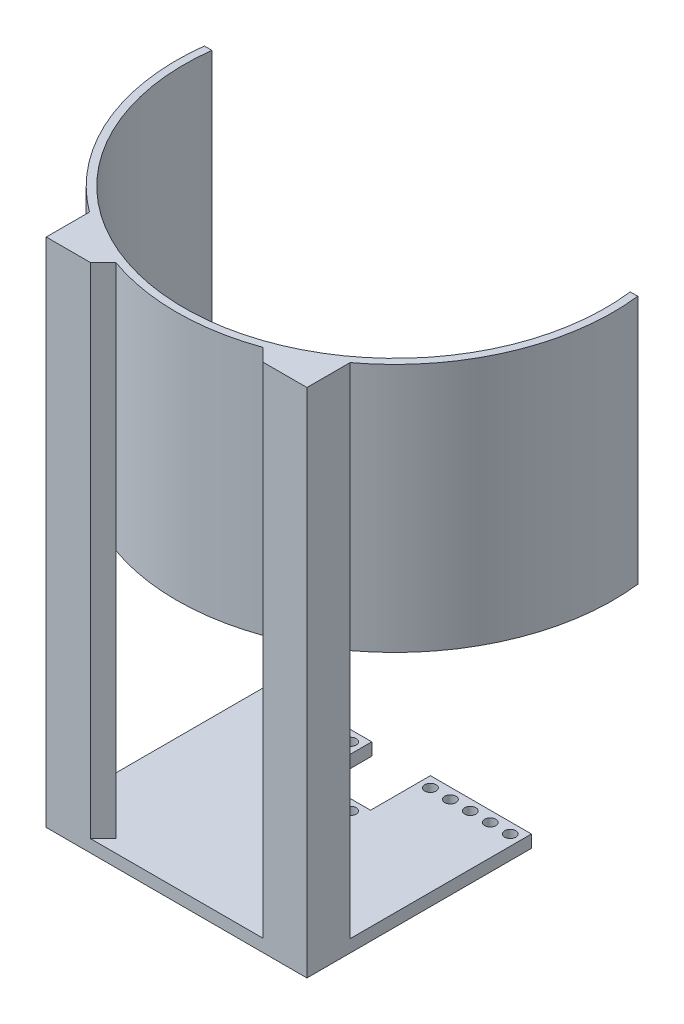
ISO-10303-21;
HEADER;
FILE_DESCRIPTION(('STEP AP214'),'2;1');
FILE_NAME('part.step','',(''),(''),'','','');
FILE_SCHEMA(('AUTOMOTIVE_DESIGN { 1 0 10303 214 1 1 1 1 }'));
ENDSEC;
DATA;
#1=APPLICATION_CONTEXT('core data for automotive mechanical design processes');
#2=APPLICATION_PROTOCOL_DEFINITION('international standard','automotive_design',2000,#1);
#3=PRODUCT_CONTEXT('',#1,'mechanical');
#4=PRODUCT('Part','Part','',(#3));
#5=PRODUCT_RELATED_PRODUCT_CATEGORY('part','',(#4));
#6=PRODUCT_DEFINITION_FORMATION('','',#4);
#7=PRODUCT_DEFINITION_CONTEXT('part definition',#1,'design');
#8=PRODUCT_DEFINITION('design','',#6,#7);
#9=PRODUCT_DEFINITION_SHAPE('','',#8);
#10=(LENGTH_UNIT() NAMED_UNIT(*) SI_UNIT(.MILLI.,.METRE.));
#11=(NAMED_UNIT(*) PLANE_ANGLE_UNIT() SI_UNIT($,.RADIAN.));
#12=(NAMED_UNIT(*) SI_UNIT($,.STERADIAN.) SOLID_ANGLE_UNIT());
#13=UNCERTAINTY_MEASURE_WITH_UNIT(LENGTH_MEASURE(1.E-05),#10,'distance_accuracy_value','');
#14=(GEOMETRIC_REPRESENTATION_CONTEXT(3) GLOBAL_UNCERTAINTY_ASSIGNED_CONTEXT((#13)) GLOBAL_UNIT_ASSIGNED_CONTEXT((#10,
#11,#12)) REPRESENTATION_CONTEXT('',''));
#15=CARTESIAN_POINT('',(0.,0.,0.));
#16=DIRECTION('',(0.,0.,1.));
#17=DIRECTION('',(1.,0.,0.));
#18=AXIS2_PLACEMENT_3D('',#15,#16,#17);
#19=CARTESIAN_POINT('',(0.,5.,0.));
#20=DIRECTION('',(0.,1.,0.));
#21=DIRECTION('',(0.,0.,1.));
#22=AXIS2_PLACEMENT_3D('',#19,#20,#21);
#23=PLANE('',#22);
#24=CARTESIAN_POINT('',(0.,5.,-42.5));
#25=DIRECTION('',(0.,1.,0.));
#26=DIRECTION('',(0.,0.,1.));
#27=AXIS2_PLACEMENT_3D('',#24,#25,#26);
#28=CIRCLE('',#27,87.5);
#29=CARTESIAN_POINT('',(29.4628176429395,5.,39.8904871726032));
#30=VERTEX_POINT('',#29);
#31=CARTESIAN_POINT('',(52.25,5.,27.6868043153412));
#32=VERTEX_POINT('',#31);
#33=EDGE_CURVE('E261',#30,#32,#28,.T.);
#34=ORIENTED_EDGE('',*,*,#33,.T.);
#35=DIRECTION('',(0.,0.,1.));
#36=VECTOR('',#35,1.);
#37=CARTESIAN_POINT('',(52.25,5.,0.));
#38=LINE('',#37,#36);
#39=CARTESIAN_POINT('',(52.25,5.,-45.));
#40=VERTEX_POINT('',#39);
#41=EDGE_CURVE('E373',#40,#32,#38,.T.);
#42=ORIENTED_EDGE('',*,*,#41,.F.);
#43=DIRECTION('',(1.,0.,0.));
#44=VECTOR('',#43,1.);
#45=CARTESIAN_POINT('',(0.,5.,-45.));
#46=LINE('',#45,#44);
#47=CARTESIAN_POINT('',(11.75,5.,-45.));
#48=VERTEX_POINT('',#47);
#49=EDGE_CURVE('E369',#48,#40,#46,.T.);
#50=ORIENTED_EDGE('',*,*,#49,.F.);
#51=DIRECTION('',(0.,0.,-1.));
#52=VECTOR('',#51,1.);
#53=CARTESIAN_POINT('',(11.75,5.,0.));
#54=LINE('',#53,#52);
#55=CARTESIAN_POINT('',(11.75,5.,-21.));
#56=VERTEX_POINT('',#55);
#57=EDGE_CURVE('E358',#56,#48,#54,.T.);
#58=ORIENTED_EDGE('',*,*,#57,.F.);
#59=DIRECTION('',(1.,0.,0.));
#60=VECTOR('',#59,1.);
#61=CARTESIAN_POINT('',(0.,5.,-21.));
#62=LINE('',#61,#60);
#63=CARTESIAN_POINT('',(-11.75,5.,-21.));
#64=VERTEX_POINT('',#63);
#65=EDGE_CURVE('E361',#64,#56,#62,.T.);
#66=ORIENTED_EDGE('',*,*,#65,.F.);
#67=DIRECTION('',(0.,0.,-1.));
#68=VECTOR('',#67,1.);
#69=CARTESIAN_POINT('',(-11.75,5.,0.));
#70=LINE('',#69,#68);
#71=CARTESIAN_POINT('',(-11.75,5.,-45.));
#72=VERTEX_POINT('',#71);
#73=EDGE_CURVE('E364',#64,#72,#70,.T.);
#74=ORIENTED_EDGE('',*,*,#73,.T.);
#75=CARTESIAN_POINT('',(-52.25,5.,-45.));
#76=VERTEX_POINT('',#75);
#77=EDGE_CURVE('E366',#76,#72,#46,.T.);
#78=ORIENTED_EDGE('',*,*,#77,.F.);
#79=DIRECTION('',(0.,0.,1.));
#80=VECTOR('',#79,1.);
#81=CARTESIAN_POINT('',(-52.25,5.,0.));
#82=LINE('',#81,#80);
#83=CARTESIAN_POINT('',(-52.25,5.,27.6868043153412));
#84=VERTEX_POINT('',#83);
#85=EDGE_CURVE('E107',#76,#84,#82,.T.);
#86=ORIENTED_EDGE('',*,*,#85,.T.);
#87=CARTESIAN_POINT('',(0.,5.,-42.5));
#88=DIRECTION('',(0.,1.,0.));
#89=DIRECTION('',(0.,0.,1.));
#90=AXIS2_PLACEMENT_3D('',#87,#88,#89);
#91=CIRCLE('',#90,87.5);
#92=CARTESIAN_POINT('',(-29.4628176429395,5.,39.8904871726032));
#93=VERTEX_POINT('',#92);
#94=EDGE_CURVE('E320',#84,#93,#91,.T.);
#95=ORIENTED_EDGE('',*,*,#94,.T.);
#96=DIRECTION('',(0.707106781186544,0.,-0.707106781186552));
#97=VECTOR('',#96,1.);
#98=CARTESIAN_POINT('',(5.21383476483168,5.,5.21383476483162));
#99=LINE('',#98,#97);
#100=CARTESIAN_POINT('',(-34.5723304703362,5.,45.));
#101=VERTEX_POINT('',#100);
#102=EDGE_CURVE('E101',#101,#93,#99,.T.);
#103=ORIENTED_EDGE('',*,*,#102,.F.);
#104=DIRECTION('',(1.,0.,0.));
#105=VECTOR('',#104,1.);
#106=CARTESIAN_POINT('',(0.,5.,45.));
#107=LINE('',#106,#105);
#108=CARTESIAN_POINT('',(34.5723304703362,5.,45.));
#109=VERTEX_POINT('',#108);
#110=EDGE_CURVE('E371',#101,#109,#107,.T.);
#111=ORIENTED_EDGE('',*,*,#110,.T.);
#112=DIRECTION('',(-0.707106781186544,0.,-0.707106781186552));
#113=VECTOR('',#112,1.);
#114=CARTESIAN_POINT('',(-5.21383476483168,5.,5.21383476483162));
#115=LINE('',#114,#113);
#116=EDGE_CURVE('E310',#109,#30,#115,.T.);
#117=ORIENTED_EDGE('',*,*,#116,.T.);
#118=EDGE_LOOP('',(#34,#42,#50,#58,#66,#74,#78,#86,#95,#103,#111,#117));
#119=FACE_BOUND('',#118,.T.);
#120=CARTESIAN_POINT('',(16.,5.,-40.75));
#121=DIRECTION('',(0.,1.,0.));
#122=DIRECTION('',(0.,0.,1.));
#123=AXIS2_PLACEMENT_3D('',#120,#121,#122);
#124=CIRCLE('',#123,2.25);
#125=CARTESIAN_POINT('',(16.,5.,-38.5));
#126=VERTEX_POINT('',#125);
#127=EDGE_CURVE('E333',#126,#126,#124,.F.);
#128=ORIENTED_EDGE('',*,*,#127,.T.);
#129=EDGE_LOOP('',(#128));
#130=FACE_BOUND('',#129,.T.);
#131=CARTESIAN_POINT('',(32.,5.,-40.75));
#132=DIRECTION('',(0.,1.,0.));
#133=DIRECTION('',(0.,0.,1.));
#134=AXIS2_PLACEMENT_3D('',#131,#132,#133);
#135=CIRCLE('',#134,2.25);
#136=CARTESIAN_POINT('',(32.,5.,-38.5));
#137=VERTEX_POINT('',#136);
#138=EDGE_CURVE('E336',#137,#137,#135,.F.);
#139=ORIENTED_EDGE('',*,*,#138,.T.);
#140=EDGE_LOOP('',(#139));
#141=FACE_BOUND('',#140,.T.);
#142=CARTESIAN_POINT('',(48.,5.,-40.75));
#143=DIRECTION('',(0.,1.,0.));
#144=DIRECTION('',(0.,0.,1.));
#145=AXIS2_PLACEMENT_3D('',#142,#143,#144);
#146=CIRCLE('',#145,2.25);
#147=CARTESIAN_POINT('',(48.,5.,-38.5));
#148=VERTEX_POINT('',#147);
#149=EDGE_CURVE('E340',#148,#148,#146,.F.);
#150=ORIENTED_EDGE('',*,*,#149,.T.);
#151=EDGE_LOOP('',(#150));
#152=FACE_BOUND('',#151,.T.);
#153=CARTESIAN_POINT('',(-16.,5.,-40.75));
#154=DIRECTION('',(0.,1.,0.));
#155=DIRECTION('',(0.,0.,1.));
#156=AXIS2_PLACEMENT_3D('',#153,#154,#155);
#157=CIRCLE('',#156,2.25);
#158=CARTESIAN_POINT('',(-16.,5.,-38.5));
#159=VERTEX_POINT('',#158);
#160=EDGE_CURVE('E343',#159,#159,#157,.T.);
#161=ORIENTED_EDGE('',*,*,#160,.F.);
#162=EDGE_LOOP('',(#161));
#163=FACE_BOUND('',#162,.T.);
#164=CARTESIAN_POINT('',(-24.,5.,-40.75));
#165=DIRECTION('',(0.,1.,0.));
#166=DIRECTION('',(0.,0.,1.));
#167=AXIS2_PLACEMENT_3D('',#164,#165,#166);
#168=CIRCLE('',#167,2.25);
#169=CARTESIAN_POINT('',(-24.,5.,-38.5));
#170=VERTEX_POINT('',#169);
#171=EDGE_CURVE('E346',#170,#170,#168,.T.);
#172=ORIENTED_EDGE('',*,*,#171,.F.);
#173=EDGE_LOOP('',(#172));
#174=FACE_BOUND('',#173,.T.);
#175=CARTESIAN_POINT('',(-32.,5.,-40.75));
#176=DIRECTION('',(0.,1.,0.));
#177=DIRECTION('',(0.,0.,1.));
#178=AXIS2_PLACEMENT_3D('',#175,#176,#177);
#179=CIRCLE('',#178,2.25);
#180=CARTESIAN_POINT('',(-32.,5.,-38.5));
#181=VERTEX_POINT('',#180);
#182=EDGE_CURVE('E349',#181,#181,#179,.T.);
#183=ORIENTED_EDGE('',*,*,#182,.F.);
#184=EDGE_LOOP('',(#183));
#185=FACE_BOUND('',#184,.T.);
#186=CARTESIAN_POINT('',(-40.,5.,-40.75));
#187=DIRECTION('',(0.,1.,0.));
#188=DIRECTION('',(0.,0.,1.));
#189=AXIS2_PLACEMENT_3D('',#186,#187,#188);
#190=CIRCLE('',#189,2.25);
#191=CARTESIAN_POINT('',(-40.,5.,-38.5));
#192=VERTEX_POINT('',#191);
#193=EDGE_CURVE('E352',#192,#192,#190,.T.);
#194=ORIENTED_EDGE('',*,*,#193,.F.);
#195=EDGE_LOOP('',(#194));
#196=FACE_BOUND('',#195,.T.);
#197=CARTESIAN_POINT('',(-48.,5.,-40.75));
#198=DIRECTION('',(0.,1.,0.));
#199=DIRECTION('',(0.,0.,1.));
#200=AXIS2_PLACEMENT_3D('',#197,#198,#199);
#201=CIRCLE('',#200,2.25);
#202=CARTESIAN_POINT('',(-48.,5.,-38.5));
#203=VERTEX_POINT('',#202);
#204=EDGE_CURVE('E355',#203,#203,#201,.T.);
#205=ORIENTED_EDGE('',*,*,#204,.F.);
#206=EDGE_LOOP('',(#205));
#207=FACE_BOUND('',#206,.T.);
#208=CARTESIAN_POINT('',(40.,5.,-40.75));
#209=DIRECTION('',(0.,1.,0.));
#210=DIRECTION('',(0.,0.,1.));
#211=AXIS2_PLACEMENT_3D('',#208,#209,#210);
#212=CIRCLE('',#211,2.25);
#213=CARTESIAN_POINT('',(40.,5.,-38.5));
#214=VERTEX_POINT('',#213);
#215=EDGE_CURVE('E376',#214,#214,#212,.F.);
#216=ORIENTED_EDGE('',*,*,#215,.T.);
#217=EDGE_LOOP('',(#216));
#218=FACE_BOUND('',#217,.T.);
#219=CARTESIAN_POINT('',(24.,5.,-40.75));
#220=DIRECTION('',(0.,1.,0.));
#221=DIRECTION('',(0.,0.,1.));
#222=AXIS2_PLACEMENT_3D('',#219,#220,#221);
#223=CIRCLE('',#222,2.25);
#224=CARTESIAN_POINT('',(24.,5.,-38.5));
#225=VERTEX_POINT('',#224);
#226=EDGE_CURVE('E379',#225,#225,#223,.F.);
#227=ORIENTED_EDGE('',*,*,#226,.T.);
#228=EDGE_LOOP('',(#227));
#229=FACE_BOUND('',#228,.T.);
#230=CARTESIAN_POINT('',(-8.,5.,-16.75));
#231=DIRECTION('',(0.,1.,0.));
#232=DIRECTION('',(0.,0.,1.));
#233=AXIS2_PLACEMENT_3D('',#230,#231,#232);
#234=CIRCLE('',#233,2.25);
#235=CARTESIAN_POINT('',(-8.,5.,-14.5));
#236=VERTEX_POINT('',#235);
#237=EDGE_CURVE('E382',#236,#236,#234,.T.);
#238=ORIENTED_EDGE('',*,*,#237,.F.);
#239=EDGE_LOOP('',(#238));
#240=FACE_BOUND('',#239,.T.);
#241=CARTESIAN_POINT('',(0.,5.,-16.75));
#242=DIRECTION('',(0.,1.,0.));
#243=DIRECTION('',(0.,0.,1.));
#244=AXIS2_PLACEMENT_3D('',#241,#242,#243);
#245=CIRCLE('',#244,2.25);
#246=CARTESIAN_POINT('',(0.,5.,-14.5));
#247=VERTEX_POINT('',#246);
#248=EDGE_CURVE('E385',#247,#247,#245,.T.);
#249=ORIENTED_EDGE('',*,*,#248,.F.);
#250=EDGE_LOOP('',(#249));
#251=FACE_BOUND('',#250,.T.);
#252=CARTESIAN_POINT('',(8.,5.,-16.75));
#253=DIRECTION('',(0.,1.,0.));
#254=DIRECTION('',(0.,0.,1.));
#255=AXIS2_PLACEMENT_3D('',#252,#253,#254);
#256=CIRCLE('',#255,2.25);
#257=CARTESIAN_POINT('',(8.,5.,-14.5));
#258=VERTEX_POINT('',#257);
#259=EDGE_CURVE('E388',#258,#258,#256,.F.);
#260=ORIENTED_EDGE('',*,*,#259,.T.);
#261=EDGE_LOOP('',(#260));
#262=FACE_BOUND('',#261,.T.);
#263=ADVANCED_FACE('F86',(#119,#130,#141,#152,#163,#174,#185,#196,#207,#218,#229,#240,#251,
#262),#23,.T.);
#264=CARTESIAN_POINT('',(11.75,5.,0.));
#265=DIRECTION('',(-1.,0.,0.));
#266=DIRECTION('',(0.,0.,1.));
#267=AXIS2_PLACEMENT_3D('',#264,#265,#266);
#268=PLANE('',#267);
#269=DIRECTION('',(0.,0.,-1.));
#270=VECTOR('',#269,1.);
#271=CARTESIAN_POINT('',(11.75,0.,0.));
#272=LINE('',#271,#270);
#273=CARTESIAN_POINT('',(11.75,0.,-21.));
#274=VERTEX_POINT('',#273);
#275=CARTESIAN_POINT('',(11.75,0.,-45.));
#276=VERTEX_POINT('',#275);
#277=EDGE_CURVE('E415',#274,#276,#272,.T.);
#278=ORIENTED_EDGE('',*,*,#277,.F.);
#279=DIRECTION('',(0.,-1.,0.));
#280=VECTOR('',#279,1.);
#281=CARTESIAN_POINT('',(11.75,5.,-21.));
#282=LINE('',#281,#280);
#283=EDGE_CURVE('E12',#56,#274,#282,.T.);
#284=ORIENTED_EDGE('',*,*,#283,.F.);
#285=ORIENTED_EDGE('',*,*,#57,.T.);
#286=DIRECTION('',(0.,-1.,0.));
#287=VECTOR('',#286,1.);
#288=CARTESIAN_POINT('',(11.75,5.,-45.));
#289=LINE('',#288,#287);
#290=EDGE_CURVE('E391',#48,#276,#289,.T.);
#291=ORIENTED_EDGE('',*,*,#290,.T.);
#292=EDGE_LOOP('',(#278,#284,#285,#291));
#293=FACE_BOUND('',#292,.T.);
#294=ADVANCED_FACE('F470',(#293),#268,.T.);
#295=CARTESIAN_POINT('',(0.,5.,-21.));
#296=DIRECTION('',(0.,0.,-1.));
#297=DIRECTION('',(-1.,0.,0.));
#298=AXIS2_PLACEMENT_3D('',#295,#296,#297);
#299=PLANE('',#298);
#300=DIRECTION('',(1.,0.,0.));
#301=VECTOR('',#300,1.);
#302=CARTESIAN_POINT('',(0.,0.,-21.));
#303=LINE('',#302,#301);
#304=CARTESIAN_POINT('',(-11.75,0.,-21.));
#305=VERTEX_POINT('',#304);
#306=EDGE_CURVE('E418',#305,#274,#303,.T.);
#307=ORIENTED_EDGE('',*,*,#306,.F.);
#308=DIRECTION('',(0.,-1.,0.));
#309=VECTOR('',#308,1.);
#310=CARTESIAN_POINT('',(-11.75,5.,-21.));
#311=LINE('',#310,#309);
#312=EDGE_CURVE('E94',#64,#305,#311,.T.);
#313=ORIENTED_EDGE('',*,*,#312,.F.);
#314=ORIENTED_EDGE('',*,*,#65,.T.);
#315=ORIENTED_EDGE('',*,*,#283,.T.);
#316=EDGE_LOOP('',(#307,#313,#314,#315));
#317=FACE_BOUND('',#316,.T.);
#318=ADVANCED_FACE('F466',(#317),#299,.T.);
#319=CARTESIAN_POINT('',(-11.75,5.,0.));
#320=DIRECTION('',(-1.,0.,0.));
#321=DIRECTION('',(0.,0.,1.));
#322=AXIS2_PLACEMENT_3D('',#319,#320,#321);
#323=PLANE('',#322);
#324=DIRECTION('',(0.,0.,-1.));
#325=VECTOR('',#324,1.);
#326=CARTESIAN_POINT('',(-11.75,0.,0.));
#327=LINE('',#326,#325);
#328=CARTESIAN_POINT('',(-11.75,0.,-45.));
#329=VERTEX_POINT('',#328);
#330=EDGE_CURVE('E421',#305,#329,#327,.T.);
#331=ORIENTED_EDGE('',*,*,#330,.T.);
#332=DIRECTION('',(0.,-1.,0.));
#333=VECTOR('',#332,1.);
#334=CARTESIAN_POINT('',(-11.75,5.,-45.));
#335=LINE('',#334,#333);
#336=EDGE_CURVE('E453',#72,#329,#335,.T.);
#337=ORIENTED_EDGE('',*,*,#336,.F.);
#338=ORIENTED_EDGE('',*,*,#73,.F.);
#339=ORIENTED_EDGE('',*,*,#312,.T.);
#340=EDGE_LOOP('',(#331,#337,#338,#339));
#341=FACE_BOUND('',#340,.T.);
#342=ADVANCED_FACE('F457',(#341),#323,.F.);
#343=CARTESIAN_POINT('',(0.,5.,-45.));
#344=DIRECTION('',(0.,0.,-1.));
#345=DIRECTION('',(-1.,0.,0.));
#346=AXIS2_PLACEMENT_3D('',#343,#344,#345);
#347=PLANE('',#346);
#348=DIRECTION('',(1.,0.,0.));
#349=VECTOR('',#348,1.);
#350=CARTESIAN_POINT('',(0.,0.,-45.));
#351=LINE('',#350,#349);
#352=CARTESIAN_POINT('',(-52.25,0.,-45.));
#353=VERTEX_POINT('',#352);
#354=EDGE_CURVE('E424',#353,#329,#351,.T.);
#355=ORIENTED_EDGE('',*,*,#354,.F.);
#356=DIRECTION('',(0.,-1.,0.));
#357=VECTOR('',#356,1.);
#358=CARTESIAN_POINT('',(-52.25,5.,-45.));
#359=LINE('',#358,#357);
#360=EDGE_CURVE('E234',#76,#353,#359,.T.);
#361=ORIENTED_EDGE('',*,*,#360,.F.);
#362=ORIENTED_EDGE('',*,*,#77,.T.);
#363=ORIENTED_EDGE('',*,*,#336,.T.);
#364=EDGE_LOOP('',(#355,#361,#362,#363));
#365=FACE_BOUND('',#364,.T.);
#366=ADVANCED_FACE('F591',(#365),#347,.T.);
#367=CARTESIAN_POINT('',(-52.25,5.,0.));
#368=DIRECTION('',(1.,0.,0.));
#369=DIRECTION('',(0.,0.,-1.));
#370=AXIS2_PLACEMENT_3D('',#367,#368,#369);
#371=PLANE('',#370);
#372=DIRECTION('',(0.,0.,1.));
#373=VECTOR('',#372,1.);
#374=CARTESIAN_POINT('',(-52.25,0.,0.));
#375=LINE('',#374,#373);
#376=CARTESIAN_POINT('',(-52.25,0.,45.));
#377=VERTEX_POINT('',#376);
#378=EDGE_CURVE('E230',#353,#377,#375,.T.);
#379=ORIENTED_EDGE('',*,*,#378,.T.);
#380=DIRECTION('',(0.,-1.,0.));
#381=VECTOR('',#380,1.);
#382=CARTESIAN_POINT('',(-52.25,5.,45.));
#383=LINE('',#382,#381);
#384=CARTESIAN_POINT('',(-52.25,205.,45.));
#385=VERTEX_POINT('',#384);
#386=EDGE_CURVE('E224',#385,#377,#383,.T.);
#387=ORIENTED_EDGE('',*,*,#386,.F.);
#388=DIRECTION('',(0.,0.,-1.));
#389=VECTOR('',#388,1.);
#390=CARTESIAN_POINT('',(-52.25,205.,0.));
#391=LINE('',#390,#389);
#392=CARTESIAN_POINT('',(-52.25,205.,27.6868043153412));
#393=VERTEX_POINT('',#392);
#394=EDGE_CURVE('E228',#385,#393,#391,.T.);
#395=ORIENTED_EDGE('',*,*,#394,.T.);
#396=DIRECTION('',(0.,-1.,0.));
#397=VECTOR('',#396,1.);
#398=CARTESIAN_POINT('',(-52.25,205.,27.6868043153412));
#399=LINE('',#398,#397);
#400=CARTESIAN_POINT('',(-52.25,105.,27.6868043153412));
#401=VERTEX_POINT('',#400);
#402=EDGE_CURVE('E257',#393,#401,#399,.T.);
#403=ORIENTED_EDGE('',*,*,#402,.T.);
#404=DIRECTION('',(0.,-1.,0.));
#405=VECTOR('',#404,1.);
#406=CARTESIAN_POINT('',(-52.25,105.,27.6868043153412));
#407=LINE('',#406,#405);
#408=EDGE_CURVE('E330',#401,#84,#407,.T.);
#409=ORIENTED_EDGE('',*,*,#408,.T.);
#410=ORIENTED_EDGE('',*,*,#85,.F.);
#411=ORIENTED_EDGE('',*,*,#360,.T.);
#412=EDGE_LOOP('',(#379,#387,#395,#403,#409,#410,#411));
#413=FACE_BOUND('',#412,.T.);
#414=ADVANCED_FACE('F226',(#413),#371,.F.);
#415=CARTESIAN_POINT('',(0.,5.,45.));
#416=DIRECTION('',(0.,0.,-1.));
#417=DIRECTION('',(-1.,0.,0.));
#418=AXIS2_PLACEMENT_3D('',#415,#416,#417);
#419=PLANE('',#418);
#420=DIRECTION('',(1.,0.,0.));
#421=VECTOR('',#420,1.);
#422=CARTESIAN_POINT('',(0.,0.,45.));
#423=LINE('',#422,#421);
#424=CARTESIAN_POINT('',(52.25,0.,45.));
#425=VERTEX_POINT('',#424);
#426=EDGE_CURVE('E429',#377,#425,#423,.T.);
#427=ORIENTED_EDGE('',*,*,#426,.T.);
#428=DIRECTION('',(0.,-1.,0.));
#429=VECTOR('',#428,1.);
#430=CARTESIAN_POINT('',(52.25,5.,45.));
#431=LINE('',#430,#429);
#432=CARTESIAN_POINT('',(52.25,205.,45.));
#433=VERTEX_POINT('',#432);
#434=EDGE_CURVE('E235',#433,#425,#431,.T.);
#435=ORIENTED_EDGE('',*,*,#434,.F.);
#436=DIRECTION('',(-1.,0.,0.));
#437=VECTOR('',#436,1.);
#438=CARTESIAN_POINT('',(0.,205.,45.));
#439=LINE('',#438,#437);
#440=CARTESIAN_POINT('',(34.5723304703362,205.,45.));
#441=VERTEX_POINT('',#440);
#442=EDGE_CURVE('E266',#433,#441,#439,.T.);
#443=ORIENTED_EDGE('',*,*,#442,.T.);
#444=DIRECTION('',(0.,-1.,0.));
#445=VECTOR('',#444,1.);
#446=CARTESIAN_POINT('',(34.5723304703362,105.,45.));
#447=LINE('',#446,#445);
#448=EDGE_CURVE('E316',#441,#109,#447,.T.);
#449=ORIENTED_EDGE('',*,*,#448,.T.);
#450=ORIENTED_EDGE('',*,*,#110,.F.);
#451=DIRECTION('',(0.,-1.,0.));
#452=VECTOR('',#451,1.);
#453=CARTESIAN_POINT('',(-34.5723304703362,105.,45.));
#454=LINE('',#453,#452);
#455=CARTESIAN_POINT('',(-34.5723304703362,205.,45.));
#456=VERTEX_POINT('',#455);
#457=EDGE_CURVE('E250',#456,#101,#454,.T.);
#458=ORIENTED_EDGE('',*,*,#457,.F.);
#459=DIRECTION('',(-1.,0.,0.));
#460=VECTOR('',#459,1.);
#461=CARTESIAN_POINT('',(0.,205.,45.));
#462=LINE('',#461,#460);
#463=EDGE_CURVE('E242',#456,#385,#462,.T.);
#464=ORIENTED_EDGE('',*,*,#463,.T.);
#465=ORIENTED_EDGE('',*,*,#386,.T.);
#466=EDGE_LOOP('',(#427,#435,#443,#449,#450,#458,#464,#465));
#467=FACE_BOUND('',#466,.T.);
#468=ADVANCED_FACE('F248',(#467),#419,.F.);
#469=CARTESIAN_POINT('',(52.25,5.,0.));
#470=DIRECTION('',(1.,0.,0.));
#471=DIRECTION('',(0.,0.,-1.));
#472=AXIS2_PLACEMENT_3D('',#469,#470,#471);
#473=PLANE('',#472);
#474=DIRECTION('',(0.,0.,1.));
#475=VECTOR('',#474,1.);
#476=CARTESIAN_POINT('',(52.25,0.,0.));
#477=LINE('',#476,#475);
#478=CARTESIAN_POINT('',(52.25,0.,-45.));
#479=VERTEX_POINT('',#478);
#480=EDGE_CURVE('E431',#479,#425,#477,.T.);
#481=ORIENTED_EDGE('',*,*,#480,.F.);
#482=DIRECTION('',(0.,-1.,0.));
#483=VECTOR('',#482,1.);
#484=CARTESIAN_POINT('',(52.25,5.,-45.));
#485=LINE('',#484,#483);
#486=EDGE_CURVE('E449',#40,#479,#485,.T.);
#487=ORIENTED_EDGE('',*,*,#486,.F.);
#488=ORIENTED_EDGE('',*,*,#41,.T.);
#489=DIRECTION('',(0.,-1.,0.));
#490=VECTOR('',#489,1.);
#491=CARTESIAN_POINT('',(52.25,105.,27.6868043153412));
#492=LINE('',#491,#490);
#493=CARTESIAN_POINT('',(52.25,105.,27.6868043153412));
#494=VERTEX_POINT('',#493);
#495=EDGE_CURVE('E309',#494,#32,#492,.T.);
#496=ORIENTED_EDGE('',*,*,#495,.F.);
#497=DIRECTION('',(0.,-1.,0.));
#498=VECTOR('',#497,1.);
#499=CARTESIAN_POINT('',(52.25,205.,27.6868043153412));
#500=LINE('',#499,#498);
#501=CARTESIAN_POINT('',(52.25,205.,27.6868043153412));
#502=VERTEX_POINT('',#501);
#503=EDGE_CURVE('E251',#502,#494,#500,.T.);
#504=ORIENTED_EDGE('',*,*,#503,.F.);
#505=DIRECTION('',(0.,0.,1.));
#506=VECTOR('',#505,1.);
#507=CARTESIAN_POINT('',(52.25,205.,0.));
#508=LINE('',#507,#506);
#509=EDGE_CURVE('E270',#502,#433,#508,.T.);
#510=ORIENTED_EDGE('',*,*,#509,.T.);
#511=ORIENTED_EDGE('',*,*,#434,.T.);
#512=EDGE_LOOP('',(#481,#487,#488,#496,#504,#510,#511));
#513=FACE_BOUND('',#512,.T.);
#514=ADVANCED_FACE('F480',(#513),#473,.T.);
#515=CARTESIAN_POINT('',(0.,5.,-16.75));
#516=DIRECTION('',(0.,-1.,0.));
#517=DIRECTION('',(0.,0.,-1.));
#518=AXIS2_PLACEMENT_3D('',#515,#516,#517);
#519=CYLINDRICAL_SURFACE('',#518,2.25);
#520=ORIENTED_EDGE('',*,*,#248,.T.);
#521=EDGE_LOOP('',(#520));
#522=FACE_BOUND('',#521,.T.);
#523=CARTESIAN_POINT('',(0.,0.,-16.75));
#524=DIRECTION('',(0.,1.,0.));
#525=DIRECTION('',(0.,0.,1.));
#526=AXIS2_PLACEMENT_3D('',#523,#524,#525);
#527=CIRCLE('',#526,2.25);
#528=CARTESIAN_POINT('',(0.,0.,-14.5));
#529=VERTEX_POINT('',#528);
#530=EDGE_CURVE('E443',#529,#529,#527,.T.);
#531=ORIENTED_EDGE('',*,*,#530,.F.);
#532=EDGE_LOOP('',(#531));
#533=FACE_BOUND('',#532,.T.);
#534=ADVANCED_FACE('F572',(#522,#533),#519,.F.);
#535=CARTESIAN_POINT('',(-8.,5.,-16.75));
#536=DIRECTION('',(0.,-1.,0.));
#537=DIRECTION('',(0.,0.,-1.));
#538=AXIS2_PLACEMENT_3D('',#535,#536,#537);
#539=CYLINDRICAL_SURFACE('',#538,2.25);
#540=ORIENTED_EDGE('',*,*,#237,.T.);
#541=EDGE_LOOP('',(#540));
#542=FACE_BOUND('',#541,.T.);
#543=CARTESIAN_POINT('',(-8.,0.,-16.75));
#544=DIRECTION('',(0.,1.,0.));
#545=DIRECTION('',(0.,0.,1.));
#546=AXIS2_PLACEMENT_3D('',#543,#544,#545);
#547=CIRCLE('',#546,2.25);
#548=CARTESIAN_POINT('',(-8.,0.,-14.5));
#549=VERTEX_POINT('',#548);
#550=EDGE_CURVE('E440',#549,#549,#547,.T.);
#551=ORIENTED_EDGE('',*,*,#550,.F.);
#552=EDGE_LOOP('',(#551));
#553=FACE_BOUND('',#552,.T.);
#554=ADVANCED_FACE('F575',(#542,#553),#539,.F.);
#555=CARTESIAN_POINT('',(24.,5.,-40.75));
#556=DIRECTION('',(0.,-1.,0.));
#557=DIRECTION('',(0.,0.,-1.));
#558=AXIS2_PLACEMENT_3D('',#555,#556,#557);
#559=CYLINDRICAL_SURFACE('',#558,2.25);
#560=ORIENTED_EDGE('',*,*,#226,.F.);
#561=EDGE_LOOP('',(#560));
#562=FACE_BOUND('',#561,.T.);
#563=CARTESIAN_POINT('',(24.,0.,-40.75));
#564=DIRECTION('',(0.,1.,0.));
#565=DIRECTION('',(0.,0.,1.));
#566=AXIS2_PLACEMENT_3D('',#563,#564,#565);
#567=CIRCLE('',#566,2.25);
#568=CARTESIAN_POINT('',(24.,0.,-38.5));
#569=VERTEX_POINT('',#568);
#570=EDGE_CURVE('E437',#569,#569,#567,.F.);
#571=ORIENTED_EDGE('',*,*,#570,.T.);
#572=EDGE_LOOP('',(#571));
#573=FACE_BOUND('',#572,.T.);
#574=ADVANCED_FACE('F579',(#562,#573),#559,.F.);
#575=CARTESIAN_POINT('',(40.,5.,-40.75));
#576=DIRECTION('',(0.,-1.,0.));
#577=DIRECTION('',(0.,0.,-1.));
#578=AXIS2_PLACEMENT_3D('',#575,#576,#577);
#579=CYLINDRICAL_SURFACE('',#578,2.25);
#580=ORIENTED_EDGE('',*,*,#215,.F.);
#581=EDGE_LOOP('',(#580));
#582=FACE_BOUND('',#581,.T.);
#583=CARTESIAN_POINT('',(40.,0.,-40.75));
#584=DIRECTION('',(0.,1.,0.));
#585=DIRECTION('',(0.,0.,1.));
#586=AXIS2_PLACEMENT_3D('',#583,#584,#585);
#587=CIRCLE('',#586,2.25);
#588=CARTESIAN_POINT('',(40.,0.,-38.5));
#589=VERTEX_POINT('',#588);
#590=EDGE_CURVE('E434',#589,#589,#587,.F.);
#591=ORIENTED_EDGE('',*,*,#590,.T.);
#592=EDGE_LOOP('',(#591));
#593=FACE_BOUND('',#592,.T.);
#594=ADVANCED_FACE('F583',(#582,#593),#579,.F.);
#595=EDGE_CURVE('E427',#276,#479,#351,.T.);
#596=ORIENTED_EDGE('',*,*,#595,.F.);
#597=ORIENTED_EDGE('',*,*,#290,.F.);
#598=ORIENTED_EDGE('',*,*,#49,.T.);
#599=ORIENTED_EDGE('',*,*,#486,.T.);
#600=EDGE_LOOP('',(#596,#597,#598,#599));
#601=FACE_BOUND('',#600,.T.);
#602=ADVANCED_FACE('F474',(#601),#347,.T.);
#603=CARTESIAN_POINT('',(-48.,5.,-40.75));
#604=DIRECTION('',(0.,-1.,0.));
#605=DIRECTION('',(0.,0.,-1.));
#606=AXIS2_PLACEMENT_3D('',#603,#604,#605);
#607=CYLINDRICAL_SURFACE('',#606,2.25);
#608=ORIENTED_EDGE('',*,*,#204,.T.);
#609=EDGE_LOOP('',(#608));
#610=FACE_BOUND('',#609,.T.);
#611=CARTESIAN_POINT('',(-48.,0.,-40.75));
#612=DIRECTION('',(0.,1.,0.));
#613=DIRECTION('',(0.,0.,1.));
#614=AXIS2_PLACEMENT_3D('',#611,#612,#613);
#615=CIRCLE('',#614,2.25);
#616=CARTESIAN_POINT('',(-48.,0.,-38.5));
#617=VERTEX_POINT('',#616);
#618=EDGE_CURVE('E412',#617,#617,#615,.T.);
#619=ORIENTED_EDGE('',*,*,#618,.F.);
#620=EDGE_LOOP('',(#619));
#621=FACE_BOUND('',#620,.T.);
#622=ADVANCED_FACE('F590',(#610,#621),#607,.F.);
#623=CARTESIAN_POINT('',(-40.,5.,-40.75));
#624=DIRECTION('',(0.,-1.,0.));
#625=DIRECTION('',(0.,0.,-1.));
#626=AXIS2_PLACEMENT_3D('',#623,#624,#625);
#627=CYLINDRICAL_SURFACE('',#626,2.25);
#628=ORIENTED_EDGE('',*,*,#193,.T.);
#629=EDGE_LOOP('',(#628));
#630=FACE_BOUND('',#629,.T.);
#631=CARTESIAN_POINT('',(-40.,0.,-40.75));
#632=DIRECTION('',(0.,1.,0.));
#633=DIRECTION('',(0.,0.,1.));
#634=AXIS2_PLACEMENT_3D('',#631,#632,#633);
#635=CIRCLE('',#634,2.25);
#636=CARTESIAN_POINT('',(-40.,0.,-38.5));
#637=VERTEX_POINT('',#636);
#638=EDGE_CURVE('E409',#637,#637,#635,.T.);
#639=ORIENTED_EDGE('',*,*,#638,.F.);
#640=EDGE_LOOP('',(#639));
#641=FACE_BOUND('',#640,.T.);
#642=ADVANCED_FACE('F606',(#630,#641),#627,.F.);
#643=CARTESIAN_POINT('',(-32.,5.,-40.75));
#644=DIRECTION('',(0.,-1.,0.));
#645=DIRECTION('',(0.,0.,-1.));
#646=AXIS2_PLACEMENT_3D('',#643,#644,#645);
#647=CYLINDRICAL_SURFACE('',#646,2.25);
#648=ORIENTED_EDGE('',*,*,#182,.T.);
#649=EDGE_LOOP('',(#648));
#650=FACE_BOUND('',#649,.T.);
#651=CARTESIAN_POINT('',(-32.,0.,-40.75));
#652=DIRECTION('',(0.,1.,0.));
#653=DIRECTION('',(0.,0.,1.));
#654=AXIS2_PLACEMENT_3D('',#651,#652,#653);
#655=CIRCLE('',#654,2.25);
#656=CARTESIAN_POINT('',(-32.,0.,-38.5));
#657=VERTEX_POINT('',#656);
#658=EDGE_CURVE('E406',#657,#657,#655,.T.);
#659=ORIENTED_EDGE('',*,*,#658,.F.);
#660=EDGE_LOOP('',(#659));
#661=FACE_BOUND('',#660,.T.);
#662=ADVANCED_FACE('F610',(#650,#661),#647,.F.);
#663=CARTESIAN_POINT('',(-24.,5.,-40.75));
#664=DIRECTION('',(0.,-1.,0.));
#665=DIRECTION('',(0.,0.,-1.));
#666=AXIS2_PLACEMENT_3D('',#663,#664,#665);
#667=CYLINDRICAL_SURFACE('',#666,2.25);
#668=ORIENTED_EDGE('',*,*,#171,.T.);
#669=EDGE_LOOP('',(#668));
#670=FACE_BOUND('',#669,.T.);
#671=CARTESIAN_POINT('',(-24.,0.,-40.75));
#672=DIRECTION('',(0.,1.,0.));
#673=DIRECTION('',(0.,0.,1.));
#674=AXIS2_PLACEMENT_3D('',#671,#672,#673);
#675=CIRCLE('',#674,2.25);
#676=CARTESIAN_POINT('',(-24.,0.,-38.5));
#677=VERTEX_POINT('',#676);
#678=EDGE_CURVE('E403',#677,#677,#675,.T.);
#679=ORIENTED_EDGE('',*,*,#678,.F.);
#680=EDGE_LOOP('',(#679));
#681=FACE_BOUND('',#680,.T.);
#682=ADVANCED_FACE('F614',(#670,#681),#667,.F.);
#683=CARTESIAN_POINT('',(-16.,5.,-40.75));
#684=DIRECTION('',(0.,-1.,0.));
#685=DIRECTION('',(0.,0.,-1.));
#686=AXIS2_PLACEMENT_3D('',#683,#684,#685);
#687=CYLINDRICAL_SURFACE('',#686,2.25);
#688=ORIENTED_EDGE('',*,*,#160,.T.);
#689=EDGE_LOOP('',(#688));
#690=FACE_BOUND('',#689,.T.);
#691=CARTESIAN_POINT('',(-16.,0.,-40.75));
#692=DIRECTION('',(0.,1.,0.));
#693=DIRECTION('',(0.,0.,1.));
#694=AXIS2_PLACEMENT_3D('',#691,#692,#693);
#695=CIRCLE('',#694,2.25);
#696=CARTESIAN_POINT('',(-16.,0.,-38.5));
#697=VERTEX_POINT('',#696);
#698=EDGE_CURVE('E400',#697,#697,#695,.T.);
#699=ORIENTED_EDGE('',*,*,#698,.F.);
#700=EDGE_LOOP('',(#699));
#701=FACE_BOUND('',#700,.T.);
#702=ADVANCED_FACE('F618',(#690,#701),#687,.F.);
#703=CARTESIAN_POINT('',(48.,5.,-40.75));
#704=DIRECTION('',(0.,-1.,0.));
#705=DIRECTION('',(0.,0.,-1.));
#706=AXIS2_PLACEMENT_3D('',#703,#704,#705);
#707=CYLINDRICAL_SURFACE('',#706,2.25);
#708=ORIENTED_EDGE('',*,*,#149,.F.);
#709=EDGE_LOOP('',(#708));
#710=FACE_BOUND('',#709,.T.);
#711=CARTESIAN_POINT('',(48.,0.,-40.75));
#712=DIRECTION('',(0.,1.,0.));
#713=DIRECTION('',(0.,0.,1.));
#714=AXIS2_PLACEMENT_3D('',#711,#712,#713);
#715=CIRCLE('',#714,2.25);
#716=CARTESIAN_POINT('',(48.,0.,-38.5));
#717=VERTEX_POINT('',#716);
#718=EDGE_CURVE('E397',#717,#717,#715,.F.);
#719=ORIENTED_EDGE('',*,*,#718,.T.);
#720=EDGE_LOOP('',(#719));
#721=FACE_BOUND('',#720,.T.);
#722=ADVANCED_FACE('F622',(#710,#721),#707,.F.);
#723=CARTESIAN_POINT('',(32.,5.,-40.75));
#724=DIRECTION('',(0.,-1.,0.));
#725=DIRECTION('',(0.,0.,-1.));
#726=AXIS2_PLACEMENT_3D('',#723,#724,#725);
#727=CYLINDRICAL_SURFACE('',#726,2.25);
#728=ORIENTED_EDGE('',*,*,#138,.F.);
#729=EDGE_LOOP('',(#728));
#730=FACE_BOUND('',#729,.T.);
#731=CARTESIAN_POINT('',(32.,0.,-40.75));
#732=DIRECTION('',(0.,1.,0.));
#733=DIRECTION('',(0.,0.,1.));
#734=AXIS2_PLACEMENT_3D('',#731,#732,#733);
#735=CIRCLE('',#734,2.25);
#736=CARTESIAN_POINT('',(32.,0.,-38.5));
#737=VERTEX_POINT('',#736);
#738=EDGE_CURVE('E394',#737,#737,#735,.F.);
#739=ORIENTED_EDGE('',*,*,#738,.T.);
#740=EDGE_LOOP('',(#739));
#741=FACE_BOUND('',#740,.T.);
#742=ADVANCED_FACE('F625',(#730,#741),#727,.F.);
#743=CARTESIAN_POINT('',(16.,5.,-40.75));
#744=DIRECTION('',(0.,-1.,0.));
#745=DIRECTION('',(0.,0.,-1.));
#746=AXIS2_PLACEMENT_3D('',#743,#744,#745);
#747=CYLINDRICAL_SURFACE('',#746,2.25);
#748=ORIENTED_EDGE('',*,*,#127,.F.);
#749=EDGE_LOOP('',(#748));
#750=FACE_BOUND('',#749,.T.);
#751=CARTESIAN_POINT('',(16.,0.,-40.75));
#752=DIRECTION('',(0.,1.,0.));
#753=DIRECTION('',(0.,0.,1.));
#754=AXIS2_PLACEMENT_3D('',#751,#752,#753);
#755=CIRCLE('',#754,2.25);
#756=CARTESIAN_POINT('',(16.,0.,-38.5));
#757=VERTEX_POINT('',#756);
#758=EDGE_CURVE('E332',#757,#757,#755,.F.);
#759=ORIENTED_EDGE('',*,*,#758,.T.);
#760=EDGE_LOOP('',(#759));
#761=FACE_BOUND('',#760,.T.);
#762=ADVANCED_FACE('F88',(#750,#761),#747,.F.);
#763=CARTESIAN_POINT('',(8.,5.,-16.75));
#764=DIRECTION('',(0.,-1.,0.));
#765=DIRECTION('',(0.,0.,-1.));
#766=AXIS2_PLACEMENT_3D('',#763,#764,#765);
#767=CYLINDRICAL_SURFACE('',#766,2.25);
#768=ORIENTED_EDGE('',*,*,#259,.F.);
#769=EDGE_LOOP('',(#768));
#770=FACE_BOUND('',#769,.T.);
#771=CARTESIAN_POINT('',(8.,0.,-16.75));
#772=DIRECTION('',(0.,1.,0.));
#773=DIRECTION('',(0.,0.,1.));
#774=AXIS2_PLACEMENT_3D('',#771,#772,#773);
#775=CIRCLE('',#774,2.25);
#776=CARTESIAN_POINT('',(8.,0.,-14.5));
#777=VERTEX_POINT('',#776);
#778=EDGE_CURVE('E337',#777,#777,#775,.F.);
#779=ORIENTED_EDGE('',*,*,#778,.T.);
#780=EDGE_LOOP('',(#779));
#781=FACE_BOUND('',#780,.T.);
#782=ADVANCED_FACE('F556',(#770,#781),#767,.F.);
#783=CARTESIAN_POINT('',(0.,0.,0.));
#784=DIRECTION('',(0.,1.,0.));
#785=DIRECTION('',(0.,0.,1.));
#786=AXIS2_PLACEMENT_3D('',#783,#784,#785);
#787=PLANE('',#786);
#788=ORIENTED_EDGE('',*,*,#758,.F.);
#789=EDGE_LOOP('',(#788));
#790=FACE_BOUND('',#789,.T.);
#791=ORIENTED_EDGE('',*,*,#738,.F.);
#792=EDGE_LOOP('',(#791));
#793=FACE_BOUND('',#792,.T.);
#794=ORIENTED_EDGE('',*,*,#718,.F.);
#795=EDGE_LOOP('',(#794));
#796=FACE_BOUND('',#795,.T.);
#797=ORIENTED_EDGE('',*,*,#698,.T.);
#798=EDGE_LOOP('',(#797));
#799=FACE_BOUND('',#798,.T.);
#800=ORIENTED_EDGE('',*,*,#678,.T.);
#801=EDGE_LOOP('',(#800));
#802=FACE_BOUND('',#801,.T.);
#803=ORIENTED_EDGE('',*,*,#658,.T.);
#804=EDGE_LOOP('',(#803));
#805=FACE_BOUND('',#804,.T.);
#806=ORIENTED_EDGE('',*,*,#638,.T.);
#807=EDGE_LOOP('',(#806));
#808=FACE_BOUND('',#807,.T.);
#809=ORIENTED_EDGE('',*,*,#618,.T.);
#810=EDGE_LOOP('',(#809));
#811=FACE_BOUND('',#810,.T.);
#812=ORIENTED_EDGE('',*,*,#277,.T.);
#813=ORIENTED_EDGE('',*,*,#595,.T.);
#814=ORIENTED_EDGE('',*,*,#480,.T.);
#815=ORIENTED_EDGE('',*,*,#426,.F.);
#816=ORIENTED_EDGE('',*,*,#378,.F.);
#817=ORIENTED_EDGE('',*,*,#354,.T.);
#818=ORIENTED_EDGE('',*,*,#330,.F.);
#819=ORIENTED_EDGE('',*,*,#306,.T.);
#820=EDGE_LOOP('',(#812,#813,#814,#815,#816,#817,#818,#819));
#821=FACE_BOUND('',#820,.T.);
#822=ORIENTED_EDGE('',*,*,#590,.F.);
#823=EDGE_LOOP('',(#822));
#824=FACE_BOUND('',#823,.T.);
#825=ORIENTED_EDGE('',*,*,#570,.F.);
#826=EDGE_LOOP('',(#825));
#827=FACE_BOUND('',#826,.T.);
#828=ORIENTED_EDGE('',*,*,#550,.T.);
#829=EDGE_LOOP('',(#828));
#830=FACE_BOUND('',#829,.T.);
#831=ORIENTED_EDGE('',*,*,#530,.T.);
#832=EDGE_LOOP('',(#831));
#833=FACE_BOUND('',#832,.T.);
#834=ORIENTED_EDGE('',*,*,#778,.F.);
#835=EDGE_LOOP('',(#834));
#836=FACE_BOUND('',#835,.T.);
#837=ADVANCED_FACE('F463',(#790,#793,#796,#799,#802,#805,#808,#811,#821,#824,#827,#830,#833,
#836),#787,.F.);
#838=CARTESIAN_POINT('',(0.,105.,-42.5));
#839=DIRECTION('',(0.,-1.,0.));
#840=DIRECTION('',(0.,0.,-1.));
#841=AXIS2_PLACEMENT_3D('',#838,#839,#840);
#842=CYLINDRICAL_SURFACE('',#841,87.5);
#843=ORIENTED_EDGE('',*,*,#94,.F.);
#844=ORIENTED_EDGE('',*,*,#408,.F.);
#845=CARTESIAN_POINT('',(0.,105.,-42.5));
#846=DIRECTION('',(0.,1.,0.));
#847=DIRECTION('',(0.,0.,1.));
#848=AXIS2_PLACEMENT_3D('',#845,#846,#847);
#849=CIRCLE('',#848,87.5);
#850=CARTESIAN_POINT('',(-29.4628176429395,105.,39.8904871726032));
#851=VERTEX_POINT('',#850);
#852=EDGE_CURVE('E321',#401,#851,#849,.T.);
#853=ORIENTED_EDGE('',*,*,#852,.T.);
#854=DIRECTION('',(0.,-1.,0.));
#855=VECTOR('',#854,1.);
#856=CARTESIAN_POINT('',(-29.4628176429395,105.,39.8904871726032));
#857=LINE('',#856,#855);
#858=EDGE_CURVE('E324',#851,#93,#857,.T.);
#859=ORIENTED_EDGE('',*,*,#858,.T.);
#860=EDGE_LOOP('',(#843,#844,#853,#859));
#861=FACE_BOUND('',#860,.T.);
#862=ADVANCED_FACE('F525',(#861),#842,.F.);
#863=CARTESIAN_POINT('',(5.21383476483168,105.,5.21383476483162));
#864=DIRECTION('',(-0.707106781186552,0.,-0.707106781186544));
#865=DIRECTION('',(-0.707106781186544,0.,0.707106781186551));
#866=AXIS2_PLACEMENT_3D('',#863,#864,#865);
#867=PLANE('',#866);
#868=ORIENTED_EDGE('',*,*,#102,.T.);
#869=ORIENTED_EDGE('',*,*,#858,.F.);
#870=DIRECTION('',(0.,-1.,0.));
#871=VECTOR('',#870,1.);
#872=CARTESIAN_POINT('',(-29.4628176429395,205.,39.8904871726032));
#873=LINE('',#872,#871);
#874=CARTESIAN_POINT('',(-29.4628176429395,205.,39.8904871726032));
#875=VERTEX_POINT('',#874);
#876=EDGE_CURVE('E258',#875,#851,#873,.T.);
#877=ORIENTED_EDGE('',*,*,#876,.F.);
#878=DIRECTION('',(-0.707106781186544,0.,0.707106781186552));
#879=VECTOR('',#878,1.);
#880=CARTESIAN_POINT('',(5.21383476483168,205.,5.21383476483162));
#881=LINE('',#880,#879);
#882=EDGE_CURVE('E246',#875,#456,#881,.T.);
#883=ORIENTED_EDGE('',*,*,#882,.T.);
#884=ORIENTED_EDGE('',*,*,#457,.T.);
#885=EDGE_LOOP('',(#868,#869,#877,#883,#884));
#886=FACE_BOUND('',#885,.T.);
#887=ADVANCED_FACE('F502',(#886),#867,.F.);
#888=CARTESIAN_POINT('',(0.,105.,-42.5));
#889=DIRECTION('',(0.,-1.,0.));
#890=DIRECTION('',(0.,0.,-1.));
#891=AXIS2_PLACEMENT_3D('',#888,#889,#890);
#892=CYLINDRICAL_SURFACE('',#891,87.5);
#893=ORIENTED_EDGE('',*,*,#33,.F.);
#894=DIRECTION('',(0.,-1.,0.));
#895=VECTOR('',#894,1.);
#896=CARTESIAN_POINT('',(29.4628176429395,105.,39.8904871726032));
#897=LINE('',#896,#895);
#898=CARTESIAN_POINT('',(29.4628176429395,105.,39.8904871726032));
#899=VERTEX_POINT('',#898);
#900=EDGE_CURVE('E318',#899,#30,#897,.T.);
#901=ORIENTED_EDGE('',*,*,#900,.F.);
#902=CARTESIAN_POINT('',(0.,105.,-42.5));
#903=DIRECTION('',(0.,1.,0.));
#904=DIRECTION('',(0.,0.,1.));
#905=AXIS2_PLACEMENT_3D('',#902,#903,#904);
#906=CIRCLE('',#905,87.5);
#907=EDGE_CURVE('E306',#899,#494,#906,.T.);
#908=ORIENTED_EDGE('',*,*,#907,.T.);
#909=ORIENTED_EDGE('',*,*,#495,.T.);
#910=EDGE_LOOP('',(#893,#901,#908,#909));
#911=FACE_BOUND('',#910,.T.);
#912=ADVANCED_FACE('F710',(#911),#892,.F.);
#913=CARTESIAN_POINT('',(-5.21383476483168,105.,5.21383476483162));
#914=DIRECTION('',(-0.707106781186552,0.,0.707106781186544));
#915=DIRECTION('',(0.707106781186544,0.,0.707106781186551));
#916=AXIS2_PLACEMENT_3D('',#913,#914,#915);
#917=PLANE('',#916);
#918=ORIENTED_EDGE('',*,*,#116,.F.);
#919=ORIENTED_EDGE('',*,*,#448,.F.);
#920=DIRECTION('',(0.707106781186544,0.,0.707106781186552));
#921=VECTOR('',#920,1.);
#922=CARTESIAN_POINT('',(-5.21383476483168,205.,5.21383476483162));
#923=LINE('',#922,#921);
#924=CARTESIAN_POINT('',(29.4628176429395,205.,39.8904871726032));
#925=VERTEX_POINT('',#924);
#926=EDGE_CURVE('E263',#925,#441,#923,.T.);
#927=ORIENTED_EDGE('',*,*,#926,.F.);
#928=DIRECTION('',(0.,-1.,0.));
#929=VECTOR('',#928,1.);
#930=CARTESIAN_POINT('',(29.4628176429395,205.,39.8904871726032));
#931=LINE('',#930,#929);
#932=EDGE_CURVE('E253',#925,#899,#931,.T.);
#933=ORIENTED_EDGE('',*,*,#932,.T.);
#934=ORIENTED_EDGE('',*,*,#900,.T.);
#935=EDGE_LOOP('',(#918,#919,#927,#933,#934));
#936=FACE_BOUND('',#935,.T.);
#937=ADVANCED_FACE('F500',(#936),#917,.T.);
#938=CARTESIAN_POINT('',(0.,105.,-42.5));
#939=DIRECTION('',(0.,1.,0.));
#940=DIRECTION('',(0.,0.,1.));
#941=AXIS2_PLACEMENT_3D('',#938,#939,#940);
#942=PLANE('',#941);
#943=ORIENTED_EDGE('',*,*,#852,.F.);
#944=CARTESIAN_POINT('',(0.,105.,-42.5));
#945=DIRECTION('',(0.,1.,0.));
#946=DIRECTION('',(0.,0.,1.));
#947=AXIS2_PLACEMENT_3D('',#944,#945,#946);
#948=CIRCLE('',#947,87.5);
#949=CARTESIAN_POINT('',(-86.867715521936,105.,-53.));
#950=VERTEX_POINT('',#949);
#951=EDGE_CURVE('E293',#950,#401,#948,.T.);
#952=ORIENTED_EDGE('',*,*,#951,.F.);
#953=DIRECTION('',(-1.,0.,0.));
#954=VECTOR('',#953,1.);
#955=CARTESIAN_POINT('',(0.,105.,-53.));
#956=LINE('',#955,#954);
#957=CARTESIAN_POINT('',(-83.8450952650183,105.,-53.));
#958=VERTEX_POINT('',#957);
#959=EDGE_CURVE('E278',#958,#950,#956,.T.);
#960=ORIENTED_EDGE('',*,*,#959,.F.);
#961=CARTESIAN_POINT('',(0.,105.,-42.5));
#962=DIRECTION('',(0.,1.,0.));
#963=DIRECTION('',(0.,0.,1.));
#964=AXIS2_PLACEMENT_3D('',#961,#962,#963);
#965=CIRCLE('',#964,84.5);
#966=CARTESIAN_POINT('',(83.8450952650183,105.,-53.));
#967=VERTEX_POINT('',#966);
#968=EDGE_CURVE('E286',#958,#967,#965,.T.);
#969=ORIENTED_EDGE('',*,*,#968,.T.);
#970=DIRECTION('',(-1.,0.,0.));
#971=VECTOR('',#970,1.);
#972=CARTESIAN_POINT('',(0.,105.,-53.));
#973=LINE('',#972,#971);
#974=CARTESIAN_POINT('',(86.867715521936,105.,-53.));
#975=VERTEX_POINT('',#974);
#976=EDGE_CURVE('E289',#975,#967,#973,.T.);
#977=ORIENTED_EDGE('',*,*,#976,.F.);
#978=EDGE_CURVE('E292',#494,#975,#948,.T.);
#979=ORIENTED_EDGE('',*,*,#978,.F.);
#980=ORIENTED_EDGE('',*,*,#907,.F.);
#981=EDGE_CURVE('E296',#851,#899,#948,.T.);
#982=ORIENTED_EDGE('',*,*,#981,.F.);
#983=EDGE_LOOP('',(#943,#952,#960,#969,#977,#979,#980,#982));
#984=FACE_BOUND('',#983,.T.);
#985=ADVANCED_FACE('F505',(#984),#942,.F.);
#986=CARTESIAN_POINT('',(0.,205.,-42.5));
#987=DIRECTION('',(0.,1.,0.));
#988=DIRECTION('',(0.,0.,1.));
#989=AXIS2_PLACEMENT_3D('',#986,#987,#988);
#990=PLANE('',#989);
#991=ORIENTED_EDGE('',*,*,#463,.F.);
#992=ORIENTED_EDGE('',*,*,#882,.F.);
#993=CARTESIAN_POINT('',(0.,205.,-42.5));
#994=DIRECTION('',(0.,1.,0.));
#995=DIRECTION('',(0.,0.,1.));
#996=AXIS2_PLACEMENT_3D('',#993,#994,#995);
#997=CIRCLE('',#996,87.5);
#998=EDGE_CURVE('E283',#875,#925,#997,.T.);
#999=ORIENTED_EDGE('',*,*,#998,.T.);
#1000=ORIENTED_EDGE('',*,*,#926,.T.);
#1001=ORIENTED_EDGE('',*,*,#442,.F.);
#1002=ORIENTED_EDGE('',*,*,#509,.F.);
#1003=CARTESIAN_POINT('',(86.867715521936,205.,-53.));
#1004=VERTEX_POINT('',#1003);
#1005=EDGE_CURVE('E280',#502,#1004,#997,.T.);
#1006=ORIENTED_EDGE('',*,*,#1005,.T.);
#1007=DIRECTION('',(-1.,0.,0.));
#1008=VECTOR('',#1007,1.);
#1009=CARTESIAN_POINT('',(0.,205.,-53.));
#1010=LINE('',#1009,#1008);
#1011=CARTESIAN_POINT('',(83.8450952650183,205.,-53.));
#1012=VERTEX_POINT('',#1011);
#1013=EDGE_CURVE('E277',#1004,#1012,#1010,.T.);
#1014=ORIENTED_EDGE('',*,*,#1013,.T.);
#1015=CARTESIAN_POINT('',(0.,205.,-42.5));
#1016=DIRECTION('',(0.,1.,0.));
#1017=DIRECTION('',(0.,0.,1.));
#1018=AXIS2_PLACEMENT_3D('',#1015,#1016,#1017);
#1019=CIRCLE('',#1018,84.5);
#1020=CARTESIAN_POINT('',(-83.8450952650183,205.,-53.));
#1021=VERTEX_POINT('',#1020);
#1022=EDGE_CURVE('E274',#1021,#1012,#1019,.T.);
#1023=ORIENTED_EDGE('',*,*,#1022,.F.);
#1024=DIRECTION('',(-1.,0.,0.));
#1025=VECTOR('',#1024,1.);
#1026=CARTESIAN_POINT('',(0.,205.,-53.));
#1027=LINE('',#1026,#1025);
#1028=CARTESIAN_POINT('',(-86.867715521936,205.,-53.));
#1029=VERTEX_POINT('',#1028);
#1030=EDGE_CURVE('E282',#1021,#1029,#1027,.T.);
#1031=ORIENTED_EDGE('',*,*,#1030,.T.);
#1032=EDGE_CURVE('E245',#1029,#393,#997,.T.);
#1033=ORIENTED_EDGE('',*,*,#1032,.T.);
#1034=ORIENTED_EDGE('',*,*,#394,.F.);
#1035=EDGE_LOOP('',(#991,#992,#999,#1000,#1001,#1002,#1006,#1014,#1023,#1031,#1033,#1034));
#1036=FACE_BOUND('',#1035,.T.);
#1037=ADVANCED_FACE('F240',(#1036),#990,.T.);
#1038=CARTESIAN_POINT('',(0.,205.,-53.));
#1039=DIRECTION('',(0.,0.,1.));
#1040=DIRECTION('',(1.,0.,0.));
#1041=AXIS2_PLACEMENT_3D('',#1038,#1039,#1040);
#1042=PLANE('',#1041);
#1043=ORIENTED_EDGE('',*,*,#959,.T.);
#1044=DIRECTION('',(0.,-1.,0.));
#1045=VECTOR('',#1044,1.);
#1046=CARTESIAN_POINT('',(-86.867715521936,205.,-53.));
#1047=LINE('',#1046,#1045);
#1048=EDGE_CURVE('E299',#1029,#950,#1047,.T.);
#1049=ORIENTED_EDGE('',*,*,#1048,.F.);
#1050=ORIENTED_EDGE('',*,*,#1030,.F.);
#1051=DIRECTION('',(0.,-1.,0.));
#1052=VECTOR('',#1051,1.);
#1053=CARTESIAN_POINT('',(-83.8450952650183,205.,-53.));
#1054=LINE('',#1053,#1052);
#1055=EDGE_CURVE('E267',#1021,#958,#1054,.T.);
#1056=ORIENTED_EDGE('',*,*,#1055,.T.);
#1057=EDGE_LOOP('',(#1043,#1049,#1050,#1056));
#1058=FACE_BOUND('',#1057,.T.);
#1059=ADVANCED_FACE('F520',(#1058),#1042,.F.);
#1060=CARTESIAN_POINT('',(0.,205.,-42.5));
#1061=DIRECTION('',(0.,-1.,0.));
#1062=DIRECTION('',(0.,0.,-1.));
#1063=AXIS2_PLACEMENT_3D('',#1060,#1061,#1062);
#1064=CYLINDRICAL_SURFACE('',#1063,87.5);
#1065=ORIENTED_EDGE('',*,*,#402,.F.);
#1066=ORIENTED_EDGE('',*,*,#1032,.F.);
#1067=ORIENTED_EDGE('',*,*,#1048,.T.);
#1068=ORIENTED_EDGE('',*,*,#951,.T.);
#1069=EDGE_LOOP('',(#1065,#1066,#1067,#1068));
#1070=FACE_BOUND('',#1069,.T.);
#1071=ADVANCED_FACE('F522',(#1070),#1064,.T.);
#1072=ORIENTED_EDGE('',*,*,#998,.F.);
#1073=ORIENTED_EDGE('',*,*,#876,.T.);
#1074=ORIENTED_EDGE('',*,*,#981,.T.);
#1075=ORIENTED_EDGE('',*,*,#932,.F.);
#1076=EDGE_LOOP('',(#1072,#1073,#1074,#1075));
#1077=FACE_BOUND('',#1076,.T.);
#1078=ADVANCED_FACE('F495',(#1077),#1064,.T.);
#1079=ORIENTED_EDGE('',*,*,#503,.T.);
#1080=ORIENTED_EDGE('',*,*,#978,.T.);
#1081=DIRECTION('',(0.,-1.,0.));
#1082=VECTOR('',#1081,1.);
#1083=CARTESIAN_POINT('',(86.867715521936,205.,-53.));
#1084=LINE('',#1083,#1082);
#1085=EDGE_CURVE('E302',#1004,#975,#1084,.T.);
#1086=ORIENTED_EDGE('',*,*,#1085,.F.);
#1087=ORIENTED_EDGE('',*,*,#1005,.F.);
#1088=EDGE_LOOP('',(#1079,#1080,#1086,#1087));
#1089=FACE_BOUND('',#1088,.T.);
#1090=ADVANCED_FACE('F489',(#1089),#1064,.T.);
#1091=CARTESIAN_POINT('',(0.,205.,-53.));
#1092=DIRECTION('',(0.,0.,1.));
#1093=DIRECTION('',(1.,0.,0.));
#1094=AXIS2_PLACEMENT_3D('',#1091,#1092,#1093);
#1095=PLANE('',#1094);
#1096=ORIENTED_EDGE('',*,*,#976,.T.);
#1097=DIRECTION('',(0.,-1.,0.));
#1098=VECTOR('',#1097,1.);
#1099=CARTESIAN_POINT('',(83.8450952650183,205.,-53.));
#1100=LINE('',#1099,#1098);
#1101=EDGE_CURVE('E285',#1012,#967,#1100,.T.);
#1102=ORIENTED_EDGE('',*,*,#1101,.F.);
#1103=ORIENTED_EDGE('',*,*,#1013,.F.);
#1104=ORIENTED_EDGE('',*,*,#1085,.T.);
#1105=EDGE_LOOP('',(#1096,#1102,#1103,#1104));
#1106=FACE_BOUND('',#1105,.T.);
#1107=ADVANCED_FACE('F510',(#1106),#1095,.F.);
#1108=CARTESIAN_POINT('',(0.,205.,-42.5));
#1109=DIRECTION('',(0.,-1.,0.));
#1110=DIRECTION('',(0.,0.,-1.));
#1111=AXIS2_PLACEMENT_3D('',#1108,#1109,#1110);
#1112=CYLINDRICAL_SURFACE('',#1111,84.5);
#1113=ORIENTED_EDGE('',*,*,#968,.F.);
#1114=ORIENTED_EDGE('',*,*,#1055,.F.);
#1115=ORIENTED_EDGE('',*,*,#1022,.T.);
#1116=ORIENTED_EDGE('',*,*,#1101,.T.);
#1117=EDGE_LOOP('',(#1113,#1114,#1115,#1116));
#1118=FACE_BOUND('',#1117,.T.);
#1119=ADVANCED_FACE('F515',(#1118),#1112,.F.);
#1120=CLOSED_SHELL('',(#263,#294,#318,#342,#366,#414,#468,#514,#534,#554,#574,#594,#602,#622,
#642,#662,#682,#702,#722,#742,#762,#782,#837,#862,#887,#912,#937,#985,#1037,#1059,#1071,#1078,
#1090,#1107,#1119));
#1121=MANIFOLD_SOLID_BREP('B2',#1120);
#1122=ADVANCED_BREP_SHAPE_REPRESENTATION('',(#18,#1121),#14);
#1123=SHAPE_DEFINITION_REPRESENTATION(#9,#1122);
ENDSEC;
END-ISO-10303-21;
